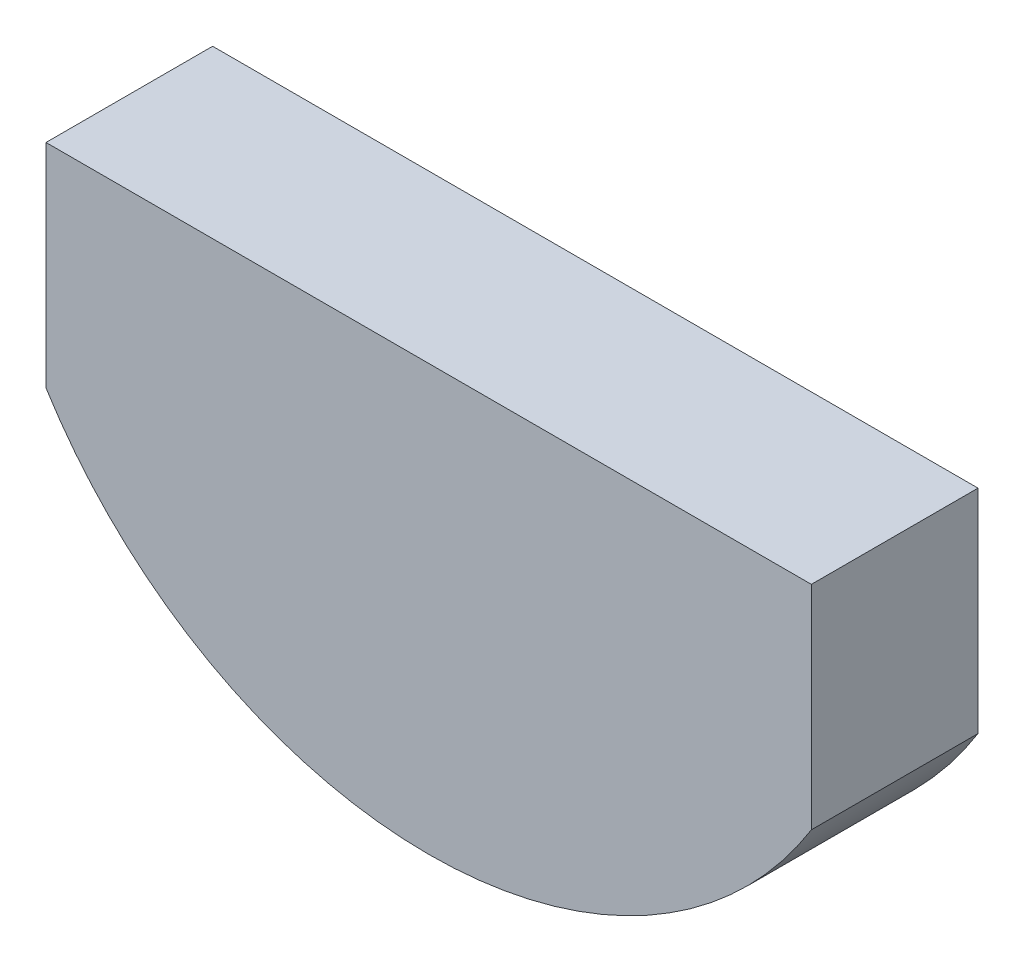
ISO-10303-21;
HEADER;
FILE_DESCRIPTION(('STEP AP214'),'2;1');
FILE_NAME('part.step','',(''),(''),'','','');
FILE_SCHEMA(('AUTOMOTIVE_DESIGN { 1 0 10303 214 1 1 1 1 }'));
ENDSEC;
DATA;
#1=APPLICATION_CONTEXT('core data for automotive mechanical design processes');
#2=APPLICATION_PROTOCOL_DEFINITION('international standard','automotive_design',2000,#1);
#3=PRODUCT_CONTEXT('',#1,'mechanical');
#4=PRODUCT('Part','Part','',(#3));
#5=PRODUCT_RELATED_PRODUCT_CATEGORY('part','',(#4));
#6=PRODUCT_DEFINITION_FORMATION('','',#4);
#7=PRODUCT_DEFINITION_CONTEXT('part definition',#1,'design');
#8=PRODUCT_DEFINITION('design','',#6,#7);
#9=PRODUCT_DEFINITION_SHAPE('','',#8);
#10=(LENGTH_UNIT() NAMED_UNIT(*) SI_UNIT(.MILLI.,.METRE.));
#11=(NAMED_UNIT(*) PLANE_ANGLE_UNIT() SI_UNIT($,.RADIAN.));
#12=(NAMED_UNIT(*) SI_UNIT($,.STERADIAN.) SOLID_ANGLE_UNIT());
#13=UNCERTAINTY_MEASURE_WITH_UNIT(LENGTH_MEASURE(1.E-05),#10,'distance_accuracy_value','');
#14=(GEOMETRIC_REPRESENTATION_CONTEXT(3) GLOBAL_UNCERTAINTY_ASSIGNED_CONTEXT((#13)) GLOBAL_UNIT_ASSIGNED_CONTEXT((#10,
#11,#12)) REPRESENTATION_CONTEXT('',''));
#15=CARTESIAN_POINT('',(0.,0.,0.));
#16=DIRECTION('',(0.,0.,1.));
#17=DIRECTION('',(1.,0.,0.));
#18=AXIS2_PLACEMENT_3D('',#15,#16,#17);
#19=CARTESIAN_POINT('',(90.,50.,55.));
#20=DIRECTION('',(-1.,0.,0.));
#21=DIRECTION('',(0.,0.,1.));
#22=AXIS2_PLACEMENT_3D('',#19,#20,#21);
#23=PLANE('',#22);
#24=DIRECTION('',(0.,1.,0.));
#25=VECTOR('',#24,1.);
#26=CARTESIAN_POINT('',(90.,-50.,-15.808309090852));
#27=LINE('',#26,#25);
#28=CARTESIAN_POINT('',(90.,0.,-15.808309090852));
#29=VERTEX_POINT('',#28);
#30=CARTESIAN_POINT('',(90.,50.,-15.808309090852));
#31=VERTEX_POINT('',#30);
#32=EDGE_CURVE('E75',#29,#31,#27,.T.);
#33=ORIENTED_EDGE('',*,*,#32,.F.);
#34=DIRECTION('',(0.,0.,-1.));
#35=VECTOR('',#34,1.);
#36=CARTESIAN_POINT('',(90.,0.,55.));
#37=LINE('',#36,#35);
#38=CARTESIAN_POINT('',(90.,0.,-55.));
#39=VERTEX_POINT('',#38);
#40=EDGE_CURVE('E94',#29,#39,#37,.T.);
#41=ORIENTED_EDGE('',*,*,#40,.T.);
#42=DIRECTION('',(0.,-1.,0.));
#43=VECTOR('',#42,1.);
#44=CARTESIAN_POINT('',(90.,50.,-55.));
#45=LINE('',#44,#43);
#46=CARTESIAN_POINT('',(90.,50.,-55.));
#47=VERTEX_POINT('',#46);
#48=EDGE_CURVE('E11',#47,#39,#45,.T.);
#49=ORIENTED_EDGE('',*,*,#48,.F.);
#50=DIRECTION('',(0.,0.,-1.));
#51=VECTOR('',#50,1.);
#52=CARTESIAN_POINT('',(90.,50.,55.));
#53=LINE('',#52,#51);
#54=EDGE_CURVE('E55',#31,#47,#53,.T.);
#55=ORIENTED_EDGE('',*,*,#54,.F.);
#56=EDGE_LOOP('',(#33,#41,#49,#55));
#57=FACE_BOUND('',#56,.T.);
#58=ADVANCED_FACE('F35',(#57),#23,.F.);
#59=CARTESIAN_POINT('',(0.,50.,0.));
#60=DIRECTION('',(0.,-1.,0.));
#61=DIRECTION('',(0.,0.,-1.));
#62=AXIS2_PLACEMENT_3D('',#59,#60,#61);
#63=PLANE('',#62);
#64=DIRECTION('',(0.,0.,1.));
#65=VECTOR('',#64,1.);
#66=CARTESIAN_POINT('',(-90.,50.,55.));
#67=LINE('',#66,#65);
#68=CARTESIAN_POINT('',(-90.,50.,-55.));
#69=VERTEX_POINT('',#68);
#70=CARTESIAN_POINT('',(-90.,50.,-15.808309090852));
#71=VERTEX_POINT('',#70);
#72=EDGE_CURVE('E87',#69,#71,#67,.T.);
#73=ORIENTED_EDGE('',*,*,#72,.T.);
#74=DIRECTION('',(-1.,0.,0.));
#75=VECTOR('',#74,1.);
#76=CARTESIAN_POINT('',(-109.727754627702,50.,-15.808309090852));
#77=LINE('',#76,#75);
#78=EDGE_CURVE('E77',#31,#71,#77,.T.);
#79=ORIENTED_EDGE('',*,*,#78,.F.);
#80=ORIENTED_EDGE('',*,*,#54,.T.);
#81=DIRECTION('',(-1.,0.,0.));
#82=VECTOR('',#81,1.);
#83=CARTESIAN_POINT('',(-90.,50.,-55.));
#84=LINE('',#83,#82);
#85=EDGE_CURVE('E50',#47,#69,#84,.T.);
#86=ORIENTED_EDGE('',*,*,#85,.T.);
#87=EDGE_LOOP('',(#73,#79,#80,#86));
#88=FACE_BOUND('',#87,.T.);
#89=ADVANCED_FACE('F85',(#88),#63,.F.);
#90=CARTESIAN_POINT('',(0.,56.,241.815416922694));
#91=DIRECTION('',(0.,0.,-1.));
#92=DIRECTION('',(-1.,0.,0.));
#93=AXIS2_PLACEMENT_3D('',#90,#91,#92);
#94=CYLINDRICAL_SURFACE('',#93,106.);
#95=ORIENTED_EDGE('',*,*,#40,.F.);
#96=CARTESIAN_POINT('',(0.,56.,-15.808309090852));
#97=DIRECTION('',(0.,0.,-1.));
#98=DIRECTION('',(-1.,0.,0.));
#99=AXIS2_PLACEMENT_3D('',#96,#97,#98);
#100=CIRCLE('',#99,106.);
#101=CARTESIAN_POINT('',(-90.,0.,-15.808309090852));
#102=VERTEX_POINT('',#101);
#103=EDGE_CURVE('E80',#29,#102,#100,.T.);
#104=ORIENTED_EDGE('',*,*,#103,.T.);
#105=DIRECTION('',(0.,0.,1.));
#106=VECTOR('',#105,1.);
#107=CARTESIAN_POINT('',(-90.,0.,55.));
#108=LINE('',#107,#106);
#109=CARTESIAN_POINT('',(-90.,0.,-55.));
#110=VERTEX_POINT('',#109);
#111=EDGE_CURVE('E90',#110,#102,#108,.T.);
#112=ORIENTED_EDGE('',*,*,#111,.F.);
#113=CARTESIAN_POINT('',(0.,56.,-55.));
#114=DIRECTION('',(0.,0.,1.));
#115=DIRECTION('',(1.,0.,0.));
#116=AXIS2_PLACEMENT_3D('',#113,#114,#115);
#117=CIRCLE('',#116,106.);
#118=EDGE_CURVE('E97',#110,#39,#117,.T.);
#119=ORIENTED_EDGE('',*,*,#118,.T.);
#120=EDGE_LOOP('',(#95,#104,#112,#119));
#121=FACE_BOUND('',#120,.T.);
#122=ADVANCED_FACE('F114',(#121),#94,.T.);
#123=CARTESIAN_POINT('',(-90.,50.,-55.));
#124=DIRECTION('',(0.,0.,1.));
#125=DIRECTION('',(1.,0.,0.));
#126=AXIS2_PLACEMENT_3D('',#123,#124,#125);
#127=PLANE('',#126);
#128=CARTESIAN_POINT('',(0.,0.,-55.));
#129=DIRECTION('',(0.,0.,1.));
#130=DIRECTION('',(1.,0.,0.));
#131=AXIS2_PLACEMENT_3D('',#128,#129,#130);
#132=CIRCLE('',#131,5.);
#133=CARTESIAN_POINT('',(5.,0.,-55.));
#134=VERTEX_POINT('',#133);
#135=EDGE_CURVE('E38',#134,#134,#132,.T.);
#136=ORIENTED_EDGE('',*,*,#135,.T.);
#137=EDGE_LOOP('',(#136));
#138=FACE_BOUND('',#137,.T.);
#139=ORIENTED_EDGE('',*,*,#48,.T.);
#140=ORIENTED_EDGE('',*,*,#118,.F.);
#141=DIRECTION('',(0.,-1.,0.));
#142=VECTOR('',#141,1.);
#143=CARTESIAN_POINT('',(-90.,50.,-55.));
#144=LINE('',#143,#142);
#145=EDGE_CURVE('E43',#69,#110,#144,.T.);
#146=ORIENTED_EDGE('',*,*,#145,.F.);
#147=ORIENTED_EDGE('',*,*,#85,.F.);
#148=EDGE_LOOP('',(#139,#140,#146,#147));
#149=FACE_BOUND('',#148,.T.);
#150=ADVANCED_FACE('F107',(#138,#149),#127,.F.);
#151=CARTESIAN_POINT('',(-90.,50.,55.));
#152=DIRECTION('',(1.,0.,0.));
#153=DIRECTION('',(0.,0.,-1.));
#154=AXIS2_PLACEMENT_3D('',#151,#152,#153);
#155=PLANE('',#154);
#156=ORIENTED_EDGE('',*,*,#111,.T.);
#157=DIRECTION('',(0.,1.,0.));
#158=VECTOR('',#157,1.);
#159=CARTESIAN_POINT('',(-90.,-50.,-15.808309090852));
#160=LINE('',#159,#158);
#161=EDGE_CURVE('E83',#102,#71,#160,.T.);
#162=ORIENTED_EDGE('',*,*,#161,.T.);
#163=ORIENTED_EDGE('',*,*,#72,.F.);
#164=ORIENTED_EDGE('',*,*,#145,.T.);
#165=EDGE_LOOP('',(#156,#162,#163,#164));
#166=FACE_BOUND('',#165,.T.);
#167=ADVANCED_FACE('F104',(#166),#155,.F.);
#168=CARTESIAN_POINT('',(0.,0.,-45.));
#169=DIRECTION('',(0.,0.,-1.));
#170=DIRECTION('',(-1.,0.,0.));
#171=AXIS2_PLACEMENT_3D('',#168,#169,#170);
#172=CYLINDRICAL_SURFACE('',#171,5.);
#173=CARTESIAN_POINT('',(0.,0.,-65.));
#174=DIRECTION('',(0.,0.,-1.));
#175=DIRECTION('',(-1.,0.,0.));
#176=AXIS2_PLACEMENT_3D('',#173,#174,#175);
#177=CIRCLE('',#176,5.);
#178=CARTESIAN_POINT('',(-5.,0.,-65.));
#179=VERTEX_POINT('',#178);
#180=EDGE_CURVE('E111',#179,#179,#177,.T.);
#181=ORIENTED_EDGE('',*,*,#180,.F.);
#182=EDGE_LOOP('',(#181));
#183=FACE_BOUND('',#182,.T.);
#184=ORIENTED_EDGE('',*,*,#135,.F.);
#185=EDGE_LOOP('',(#184));
#186=FACE_BOUND('',#185,.T.);
#187=ADVANCED_FACE('F154',(#183,#186),#172,.T.);
#188=CARTESIAN_POINT('',(0.,0.,-65.));
#189=DIRECTION('',(0.,0.,-1.));
#190=DIRECTION('',(-1.,0.,0.));
#191=AXIS2_PLACEMENT_3D('',#188,#189,#190);
#192=PLANE('',#191);
#193=ORIENTED_EDGE('',*,*,#180,.T.);
#194=EDGE_LOOP('',(#193));
#195=FACE_BOUND('',#194,.T.);
#196=ADVANCED_FACE('F132',(#195),#192,.T.);
#197=CARTESIAN_POINT('',(-109.727754627702,-76.,-15.808309090852));
#198=DIRECTION('',(0.,0.,-1.));
#199=DIRECTION('',(-1.,0.,0.));
#200=AXIS2_PLACEMENT_3D('',#197,#198,#199);
#201=PLANE('',#200);
#202=ORIENTED_EDGE('',*,*,#103,.F.);
#203=ORIENTED_EDGE('',*,*,#32,.T.);
#204=ORIENTED_EDGE('',*,*,#78,.T.);
#205=ORIENTED_EDGE('',*,*,#161,.F.);
#206=EDGE_LOOP('',(#202,#203,#204,#205));
#207=FACE_BOUND('',#206,.T.);
#208=ADVANCED_FACE('F76',(#207),#201,.F.);
#209=CLOSED_SHELL('',(#58,#89,#122,#150,#167,#187,#196,#208));
#210=MANIFOLD_SOLID_BREP('B2',#209);
#211=ADVANCED_BREP_SHAPE_REPRESENTATION('',(#18,#210),#14);
#212=SHAPE_DEFINITION_REPRESENTATION(#9,#211);
ENDSEC;
END-ISO-10303-21;
